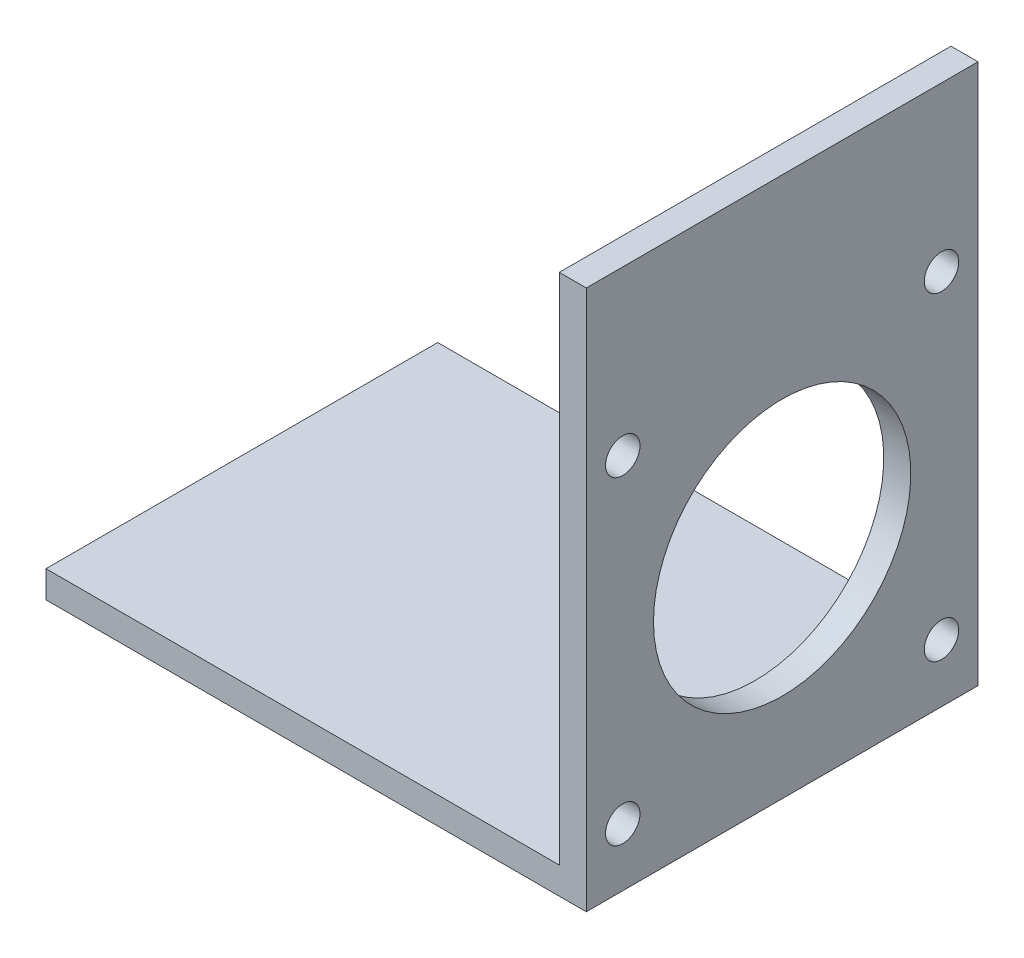
ISO-10303-21;
HEADER;
FILE_DESCRIPTION(('STEP AP214'),'2;1');
FILE_NAME('part.step','',(''),(''),'','','');
FILE_SCHEMA(('AUTOMOTIVE_DESIGN { 1 0 10303 214 1 1 1 1 }'));
ENDSEC;
DATA;
#1=APPLICATION_CONTEXT('core data for automotive mechanical design processes');
#2=APPLICATION_PROTOCOL_DEFINITION('international standard','automotive_design',2000,#1);
#3=PRODUCT_CONTEXT('',#1,'mechanical');
#4=PRODUCT('Part','Part','',(#3));
#5=PRODUCT_RELATED_PRODUCT_CATEGORY('part','',(#4));
#6=PRODUCT_DEFINITION_FORMATION('','',#4);
#7=PRODUCT_DEFINITION_CONTEXT('part definition',#1,'design');
#8=PRODUCT_DEFINITION('design','',#6,#7);
#9=PRODUCT_DEFINITION_SHAPE('','',#8);
#10=(LENGTH_UNIT() NAMED_UNIT(*) SI_UNIT(.MILLI.,.METRE.));
#11=(NAMED_UNIT(*) PLANE_ANGLE_UNIT() SI_UNIT($,.RADIAN.));
#12=(NAMED_UNIT(*) SI_UNIT($,.STERADIAN.) SOLID_ANGLE_UNIT());
#13=UNCERTAINTY_MEASURE_WITH_UNIT(LENGTH_MEASURE(1.E-05),#10,'distance_accuracy_value','');
#14=(GEOMETRIC_REPRESENTATION_CONTEXT(3) GLOBAL_UNCERTAINTY_ASSIGNED_CONTEXT((#13)) GLOBAL_UNIT_ASSIGNED_CONTEXT((#10,
#11,#12)) REPRESENTATION_CONTEXT('',''));
#15=CARTESIAN_POINT('',(0.,0.,0.));
#16=DIRECTION('',(0.,0.,1.));
#17=DIRECTION('',(1.,0.,0.));
#18=AXIS2_PLACEMENT_3D('',#15,#16,#17);
#19=CARTESIAN_POINT('',(80.,4.,0.));
#20=DIRECTION('',(-1.,0.,0.));
#21=DIRECTION('',(0.,0.,1.));
#22=AXIS2_PLACEMENT_3D('',#19,#20,#21);
#23=PLANE('',#22);
#24=CARTESIAN_POINT('',(80.,8.59999999999998,-5.39999999999999));
#25=DIRECTION('',(-1.,0.,0.));
#26=DIRECTION('',(0.,0.,1.));
#27=AXIS2_PLACEMENT_3D('',#24,#25,#26);
#28=CIRCLE('',#27,2.55);
#29=CARTESIAN_POINT('',(80.,8.59999999999998,-2.85));
#30=VERTEX_POINT('',#29);
#31=EDGE_CURVE('E154',#30,#30,#28,.T.);
#32=ORIENTED_EDGE('',*,*,#31,.T.);
#33=EDGE_LOOP('',(#32));
#34=FACE_BOUND('',#33,.T.);
#35=CARTESIAN_POINT('',(80.,55.8,-52.6));
#36=DIRECTION('',(-1.,0.,0.));
#37=DIRECTION('',(0.,0.,1.));
#38=AXIS2_PLACEMENT_3D('',#35,#36,#37);
#39=CIRCLE('',#38,2.55);
#40=CARTESIAN_POINT('',(80.,55.8,-50.05));
#41=VERTEX_POINT('',#40);
#42=EDGE_CURVE('E162',#41,#41,#39,.T.);
#43=ORIENTED_EDGE('',*,*,#42,.T.);
#44=EDGE_LOOP('',(#43));
#45=FACE_BOUND('',#44,.T.);
#46=CARTESIAN_POINT('',(80.,32.2,-29.));
#47=DIRECTION('',(-1.,0.,0.));
#48=DIRECTION('',(0.,0.,1.));
#49=AXIS2_PLACEMENT_3D('',#46,#47,#48);
#50=CIRCLE('',#49,19.05);
#51=CARTESIAN_POINT('',(80.,32.2,-9.95));
#52=VERTEX_POINT('',#51);
#53=EDGE_CURVE('E170',#52,#52,#50,.T.);
#54=ORIENTED_EDGE('',*,*,#53,.T.);
#55=EDGE_LOOP('',(#54));
#56=FACE_BOUND('',#55,.T.);
#57=DIRECTION('',(0.,0.,-1.));
#58=VECTOR('',#57,1.);
#59=CARTESIAN_POINT('',(80.,0.,0.));
#60=LINE('',#59,#58);
#61=CARTESIAN_POINT('',(80.,0.,0.));
#62=VERTEX_POINT('',#61);
#63=CARTESIAN_POINT('',(80.,0.,-58.));
#64=VERTEX_POINT('',#63);
#65=EDGE_CURVE('E86',#62,#64,#60,.T.);
#66=ORIENTED_EDGE('',*,*,#65,.T.);
#67=DIRECTION('',(0.,-1.,0.));
#68=VECTOR('',#67,1.);
#69=CARTESIAN_POINT('',(80.,4.,-58.));
#70=LINE('',#69,#68);
#71=CARTESIAN_POINT('',(80.,80.,-58.));
#72=VERTEX_POINT('',#71);
#73=EDGE_CURVE('E94',#72,#64,#70,.T.);
#74=ORIENTED_EDGE('',*,*,#73,.F.);
#75=DIRECTION('',(0.,0.,-1.));
#76=VECTOR('',#75,1.);
#77=CARTESIAN_POINT('',(80.,80.,0.));
#78=LINE('',#77,#76);
#79=CARTESIAN_POINT('',(80.,80.,0.));
#80=VERTEX_POINT('',#79);
#81=EDGE_CURVE('E147',#80,#72,#78,.T.);
#82=ORIENTED_EDGE('',*,*,#81,.F.);
#83=DIRECTION('',(0.,-1.,0.));
#84=VECTOR('',#83,1.);
#85=CARTESIAN_POINT('',(80.,4.,0.));
#86=LINE('',#85,#84);
#87=EDGE_CURVE('E102',#80,#62,#86,.T.);
#88=ORIENTED_EDGE('',*,*,#87,.T.);
#89=EDGE_LOOP('',(#66,#74,#82,#88));
#90=FACE_BOUND('',#89,.T.);
#91=CARTESIAN_POINT('',(80.,55.8,-5.4));
#92=DIRECTION('',(-1.,0.,0.));
#93=DIRECTION('',(0.,0.,1.));
#94=AXIS2_PLACEMENT_3D('',#91,#92,#93);
#95=CIRCLE('',#94,2.55);
#96=CARTESIAN_POINT('',(80.,55.8,-2.85));
#97=VERTEX_POINT('',#96);
#98=EDGE_CURVE('E166',#97,#97,#95,.F.);
#99=ORIENTED_EDGE('',*,*,#98,.F.);
#100=EDGE_LOOP('',(#99));
#101=FACE_BOUND('',#100,.T.);
#102=CARTESIAN_POINT('',(80.,8.59999999999998,-52.6));
#103=DIRECTION('',(-1.,0.,0.));
#104=DIRECTION('',(0.,0.,1.));
#105=AXIS2_PLACEMENT_3D('',#102,#103,#104);
#106=CIRCLE('',#105,2.55);
#107=CARTESIAN_POINT('',(80.,8.59999999999998,-50.05));
#108=VERTEX_POINT('',#107);
#109=EDGE_CURVE('E158',#108,#108,#106,.F.);
#110=ORIENTED_EDGE('',*,*,#109,.F.);
#111=EDGE_LOOP('',(#110));
#112=FACE_BOUND('',#111,.T.);
#113=ADVANCED_FACE('F38',(#34,#45,#56,#90,#101,#112),#23,.F.);
#114=CARTESIAN_POINT('',(76.,80.,0.));
#115=DIRECTION('',(1.,0.,0.));
#116=DIRECTION('',(0.,0.,-1.));
#117=AXIS2_PLACEMENT_3D('',#114,#115,#116);
#118=PLANE('',#117);
#119=CARTESIAN_POINT('',(76.,8.59999999999998,-5.39999999999999));
#120=DIRECTION('',(-1.,0.,0.));
#121=DIRECTION('',(0.,0.,1.));
#122=AXIS2_PLACEMENT_3D('',#119,#120,#121);
#123=CIRCLE('',#122,2.55);
#124=CARTESIAN_POINT('',(76.,8.59999999999998,-2.85));
#125=VERTEX_POINT('',#124);
#126=EDGE_CURVE('E179',#125,#125,#123,.T.);
#127=ORIENTED_EDGE('',*,*,#126,.F.);
#128=EDGE_LOOP('',(#127));
#129=FACE_BOUND('',#128,.T.);
#130=CARTESIAN_POINT('',(76.,55.8,-52.6));
#131=DIRECTION('',(-1.,0.,0.));
#132=DIRECTION('',(0.,0.,1.));
#133=AXIS2_PLACEMENT_3D('',#130,#131,#132);
#134=CIRCLE('',#133,2.55);
#135=CARTESIAN_POINT('',(76.,55.8,-50.05));
#136=VERTEX_POINT('',#135);
#137=EDGE_CURVE('E187',#136,#136,#134,.T.);
#138=ORIENTED_EDGE('',*,*,#137,.F.);
#139=EDGE_LOOP('',(#138));
#140=FACE_BOUND('',#139,.T.);
#141=CARTESIAN_POINT('',(76.,32.2,-29.));
#142=DIRECTION('',(-1.,0.,0.));
#143=DIRECTION('',(0.,0.,1.));
#144=AXIS2_PLACEMENT_3D('',#141,#142,#143);
#145=CIRCLE('',#144,19.05);
#146=CARTESIAN_POINT('',(76.,32.2,-9.94999999999999));
#147=VERTEX_POINT('',#146);
#148=EDGE_CURVE('E174',#147,#147,#145,.T.);
#149=ORIENTED_EDGE('',*,*,#148,.F.);
#150=EDGE_LOOP('',(#149));
#151=FACE_BOUND('',#150,.T.);
#152=DIRECTION('',(0.,0.,-1.));
#153=VECTOR('',#152,1.);
#154=CARTESIAN_POINT('',(76.,4.,0.));
#155=LINE('',#154,#153);
#156=CARTESIAN_POINT('',(76.,4.,0.));
#157=VERTEX_POINT('',#156);
#158=CARTESIAN_POINT('',(76.,4.,-58.));
#159=VERTEX_POINT('',#158);
#160=EDGE_CURVE('E90',#157,#159,#155,.T.);
#161=ORIENTED_EDGE('',*,*,#160,.F.);
#162=DIRECTION('',(0.,-1.,0.));
#163=VECTOR('',#162,1.);
#164=CARTESIAN_POINT('',(76.,80.,0.));
#165=LINE('',#164,#163);
#166=CARTESIAN_POINT('',(76.,80.,0.));
#167=VERTEX_POINT('',#166);
#168=EDGE_CURVE('E138',#167,#157,#165,.T.);
#169=ORIENTED_EDGE('',*,*,#168,.F.);
#170=DIRECTION('',(0.,0.,1.));
#171=VECTOR('',#170,1.);
#172=CARTESIAN_POINT('',(76.,80.,0.));
#173=LINE('',#172,#171);
#174=CARTESIAN_POINT('',(76.,80.,-58.));
#175=VERTEX_POINT('',#174);
#176=EDGE_CURVE('E141',#175,#167,#173,.T.);
#177=ORIENTED_EDGE('',*,*,#176,.F.);
#178=DIRECTION('',(0.,-1.,0.));
#179=VECTOR('',#178,1.);
#180=CARTESIAN_POINT('',(76.,80.,-58.));
#181=LINE('',#180,#179);
#182=EDGE_CURVE('E54',#175,#159,#181,.T.);
#183=ORIENTED_EDGE('',*,*,#182,.T.);
#184=EDGE_LOOP('',(#161,#169,#177,#183));
#185=FACE_BOUND('',#184,.T.);
#186=CARTESIAN_POINT('',(76.,55.8,-5.4));
#187=DIRECTION('',(-1.,0.,0.));
#188=DIRECTION('',(0.,0.,1.));
#189=AXIS2_PLACEMENT_3D('',#186,#187,#188);
#190=CIRCLE('',#189,2.55);
#191=CARTESIAN_POINT('',(76.,55.8,-2.85));
#192=VERTEX_POINT('',#191);
#193=EDGE_CURVE('E178',#192,#192,#190,.F.);
#194=ORIENTED_EDGE('',*,*,#193,.T.);
#195=EDGE_LOOP('',(#194));
#196=FACE_BOUND('',#195,.T.);
#197=CARTESIAN_POINT('',(76.,8.59999999999998,-52.6));
#198=DIRECTION('',(-1.,0.,0.));
#199=DIRECTION('',(0.,0.,1.));
#200=AXIS2_PLACEMENT_3D('',#197,#198,#199);
#201=CIRCLE('',#200,2.55);
#202=CARTESIAN_POINT('',(76.,8.59999999999998,-50.05));
#203=VERTEX_POINT('',#202);
#204=EDGE_CURVE('E183',#203,#203,#201,.F.);
#205=ORIENTED_EDGE('',*,*,#204,.T.);
#206=EDGE_LOOP('',(#205));
#207=FACE_BOUND('',#206,.T.);
#208=ADVANCED_FACE('F195',(#129,#140,#151,#185,#196,#207),#118,.F.);
#209=CARTESIAN_POINT('',(0.,4.,0.));
#210=DIRECTION('',(0.,1.,0.));
#211=DIRECTION('',(0.,0.,1.));
#212=AXIS2_PLACEMENT_3D('',#209,#210,#211);
#213=PLANE('',#212);
#214=DIRECTION('',(1.,0.,0.));
#215=VECTOR('',#214,1.);
#216=CARTESIAN_POINT('',(0.,4.,0.));
#217=LINE('',#216,#215);
#218=CARTESIAN_POINT('',(0.,4.,0.));
#219=VERTEX_POINT('',#218);
#220=EDGE_CURVE('E103',#219,#157,#217,.T.);
#221=ORIENTED_EDGE('',*,*,#220,.T.);
#222=ORIENTED_EDGE('',*,*,#160,.T.);
#223=DIRECTION('',(1.,0.,0.));
#224=VECTOR('',#223,1.);
#225=CARTESIAN_POINT('',(0.,4.,-58.));
#226=LINE('',#225,#224);
#227=CARTESIAN_POINT('',(0.,4.,-58.));
#228=VERTEX_POINT('',#227);
#229=EDGE_CURVE('E109',#228,#159,#226,.T.);
#230=ORIENTED_EDGE('',*,*,#229,.F.);
#231=DIRECTION('',(0.,0.,-1.));
#232=VECTOR('',#231,1.);
#233=CARTESIAN_POINT('',(0.,4.,0.));
#234=LINE('',#233,#232);
#235=EDGE_CURVE('E115',#219,#228,#234,.T.);
#236=ORIENTED_EDGE('',*,*,#235,.F.);
#237=EDGE_LOOP('',(#221,#222,#230,#236));
#238=FACE_BOUND('',#237,.T.);
#239=ADVANCED_FACE('F235',(#238),#213,.T.);
#240=CARTESIAN_POINT('',(0.,4.,-58.));
#241=DIRECTION('',(0.,0.,-1.));
#242=DIRECTION('',(-1.,0.,0.));
#243=AXIS2_PLACEMENT_3D('',#240,#241,#242);
#244=PLANE('',#243);
#245=ORIENTED_EDGE('',*,*,#73,.T.);
#246=DIRECTION('',(1.,0.,0.));
#247=VECTOR('',#246,1.);
#248=CARTESIAN_POINT('',(0.,0.,-58.));
#249=LINE('',#248,#247);
#250=CARTESIAN_POINT('',(0.,0.,-58.));
#251=VERTEX_POINT('',#250);
#252=EDGE_CURVE('E81',#251,#64,#249,.T.);
#253=ORIENTED_EDGE('',*,*,#252,.F.);
#254=DIRECTION('',(0.,-1.,0.));
#255=VECTOR('',#254,1.);
#256=CARTESIAN_POINT('',(0.,4.,-58.));
#257=LINE('',#256,#255);
#258=EDGE_CURVE('E11',#228,#251,#257,.T.);
#259=ORIENTED_EDGE('',*,*,#258,.F.);
#260=ORIENTED_EDGE('',*,*,#229,.T.);
#261=ORIENTED_EDGE('',*,*,#182,.F.);
#262=DIRECTION('',(1.,0.,0.));
#263=VECTOR('',#262,1.);
#264=CARTESIAN_POINT('',(0.,80.,-58.));
#265=LINE('',#264,#263);
#266=EDGE_CURVE('E97',#175,#72,#265,.T.);
#267=ORIENTED_EDGE('',*,*,#266,.T.);
#268=EDGE_LOOP('',(#245,#253,#259,#260,#261,#267));
#269=FACE_BOUND('',#268,.T.);
#270=ADVANCED_FACE('F40',(#269),#244,.T.);
#271=CARTESIAN_POINT('',(0.,4.,0.));
#272=DIRECTION('',(-1.,0.,0.));
#273=DIRECTION('',(0.,0.,1.));
#274=AXIS2_PLACEMENT_3D('',#271,#272,#273);
#275=PLANE('',#274);
#276=DIRECTION('',(0.,0.,-1.));
#277=VECTOR('',#276,1.);
#278=CARTESIAN_POINT('',(0.,0.,0.));
#279=LINE('',#278,#277);
#280=CARTESIAN_POINT('',(0.,0.,0.));
#281=VERTEX_POINT('',#280);
#282=EDGE_CURVE('E87',#281,#251,#279,.T.);
#283=ORIENTED_EDGE('',*,*,#282,.F.);
#284=DIRECTION('',(0.,-1.,0.));
#285=VECTOR('',#284,1.);
#286=CARTESIAN_POINT('',(0.,4.,0.));
#287=LINE('',#286,#285);
#288=EDGE_CURVE('E47',#219,#281,#287,.T.);
#289=ORIENTED_EDGE('',*,*,#288,.F.);
#290=ORIENTED_EDGE('',*,*,#235,.T.);
#291=ORIENTED_EDGE('',*,*,#258,.T.);
#292=EDGE_LOOP('',(#283,#289,#290,#291));
#293=FACE_BOUND('',#292,.T.);
#294=ADVANCED_FACE('F127',(#293),#275,.T.);
#295=CARTESIAN_POINT('',(0.,4.,0.));
#296=DIRECTION('',(0.,0.,-1.));
#297=DIRECTION('',(-1.,0.,0.));
#298=AXIS2_PLACEMENT_3D('',#295,#296,#297);
#299=PLANE('',#298);
#300=ORIENTED_EDGE('',*,*,#87,.F.);
#301=DIRECTION('',(1.,0.,0.));
#302=VECTOR('',#301,1.);
#303=CARTESIAN_POINT('',(0.,80.,0.));
#304=LINE('',#303,#302);
#305=EDGE_CURVE('E150',#167,#80,#304,.T.);
#306=ORIENTED_EDGE('',*,*,#305,.F.);
#307=ORIENTED_EDGE('',*,*,#168,.T.);
#308=ORIENTED_EDGE('',*,*,#220,.F.);
#309=ORIENTED_EDGE('',*,*,#288,.T.);
#310=DIRECTION('',(1.,0.,0.));
#311=VECTOR('',#310,1.);
#312=CARTESIAN_POINT('',(0.,0.,0.));
#313=LINE('',#312,#311);
#314=EDGE_CURVE('E110',#281,#62,#313,.T.);
#315=ORIENTED_EDGE('',*,*,#314,.T.);
#316=EDGE_LOOP('',(#300,#306,#307,#308,#309,#315));
#317=FACE_BOUND('',#316,.T.);
#318=ADVANCED_FACE('F123',(#317),#299,.F.);
#319=CARTESIAN_POINT('',(0.,0.,0.));
#320=DIRECTION('',(0.,1.,0.));
#321=DIRECTION('',(0.,0.,1.));
#322=AXIS2_PLACEMENT_3D('',#319,#320,#321);
#323=PLANE('',#322);
#324=ORIENTED_EDGE('',*,*,#65,.F.);
#325=ORIENTED_EDGE('',*,*,#314,.F.);
#326=ORIENTED_EDGE('',*,*,#282,.T.);
#327=ORIENTED_EDGE('',*,*,#252,.T.);
#328=EDGE_LOOP('',(#324,#325,#326,#327));
#329=FACE_BOUND('',#328,.T.);
#330=ADVANCED_FACE('F83',(#329),#323,.F.);
#331=CARTESIAN_POINT('',(0.,80.,0.));
#332=DIRECTION('',(0.,1.,0.));
#333=DIRECTION('',(0.,0.,1.));
#334=AXIS2_PLACEMENT_3D('',#331,#332,#333);
#335=PLANE('',#334);
#336=ORIENTED_EDGE('',*,*,#305,.T.);
#337=ORIENTED_EDGE('',*,*,#81,.T.);
#338=ORIENTED_EDGE('',*,*,#266,.F.);
#339=ORIENTED_EDGE('',*,*,#176,.T.);
#340=EDGE_LOOP('',(#336,#337,#338,#339));
#341=FACE_BOUND('',#340,.T.);
#342=ADVANCED_FACE('F228',(#341),#335,.T.);
#343=CARTESIAN_POINT('',(156.,32.2,-29.));
#344=DIRECTION('',(-1.,0.,0.));
#345=DIRECTION('',(0.,0.,1.));
#346=AXIS2_PLACEMENT_3D('',#343,#344,#345);
#347=CYLINDRICAL_SURFACE('',#346,19.05);
#348=ORIENTED_EDGE('',*,*,#148,.T.);
#349=EDGE_LOOP('',(#348));
#350=FACE_BOUND('',#349,.T.);
#351=ORIENTED_EDGE('',*,*,#53,.F.);
#352=EDGE_LOOP('',(#351));
#353=FACE_BOUND('',#352,.T.);
#354=ADVANCED_FACE('F202',(#350,#353),#347,.F.);
#355=CARTESIAN_POINT('',(156.,55.8,-5.40000000000002));
#356=DIRECTION('',(-1.,0.,0.));
#357=DIRECTION('',(0.,0.,1.));
#358=AXIS2_PLACEMENT_3D('',#355,#356,#357);
#359=CYLINDRICAL_SURFACE('',#358,2.55);
#360=ORIENTED_EDGE('',*,*,#193,.F.);
#361=EDGE_LOOP('',(#360));
#362=FACE_BOUND('',#361,.T.);
#363=ORIENTED_EDGE('',*,*,#98,.T.);
#364=EDGE_LOOP('',(#363));
#365=FACE_BOUND('',#364,.T.);
#366=ADVANCED_FACE('F198',(#362,#365),#359,.F.);
#367=CARTESIAN_POINT('',(156.,55.8,-52.6));
#368=DIRECTION('',(-1.,0.,0.));
#369=DIRECTION('',(0.,0.,1.));
#370=AXIS2_PLACEMENT_3D('',#367,#368,#369);
#371=CYLINDRICAL_SURFACE('',#370,2.55);
#372=ORIENTED_EDGE('',*,*,#137,.T.);
#373=EDGE_LOOP('',(#372));
#374=FACE_BOUND('',#373,.T.);
#375=ORIENTED_EDGE('',*,*,#42,.F.);
#376=EDGE_LOOP('',(#375));
#377=FACE_BOUND('',#376,.T.);
#378=ADVANCED_FACE('F201',(#374,#377),#371,.F.);
#379=CARTESIAN_POINT('',(156.,8.59999999999998,-52.6));
#380=DIRECTION('',(-1.,0.,0.));
#381=DIRECTION('',(0.,0.,1.));
#382=AXIS2_PLACEMENT_3D('',#379,#380,#381);
#383=CYLINDRICAL_SURFACE('',#382,2.55);
#384=ORIENTED_EDGE('',*,*,#204,.F.);
#385=EDGE_LOOP('',(#384));
#386=FACE_BOUND('',#385,.T.);
#387=ORIENTED_EDGE('',*,*,#109,.T.);
#388=EDGE_LOOP('',(#387));
#389=FACE_BOUND('',#388,.T.);
#390=ADVANCED_FACE('F211',(#386,#389),#383,.F.);
#391=CARTESIAN_POINT('',(156.,8.59999999999998,-5.40000000000001));
#392=DIRECTION('',(-1.,0.,0.));
#393=DIRECTION('',(0.,0.,1.));
#394=AXIS2_PLACEMENT_3D('',#391,#392,#393);
#395=CYLINDRICAL_SURFACE('',#394,2.55);
#396=ORIENTED_EDGE('',*,*,#126,.T.);
#397=EDGE_LOOP('',(#396));
#398=FACE_BOUND('',#397,.T.);
#399=ORIENTED_EDGE('',*,*,#31,.F.);
#400=EDGE_LOOP('',(#399));
#401=FACE_BOUND('',#400,.T.);
#402=ADVANCED_FACE('F213',(#398,#401),#395,.F.);
#403=CLOSED_SHELL('',(#113,#208,#239,#270,#294,#318,#330,#342,#354,#366,#378,#390,#402));
#404=MANIFOLD_SOLID_BREP('B2',#403);
#405=ADVANCED_BREP_SHAPE_REPRESENTATION('',(#18,#404),#14);
#406=SHAPE_DEFINITION_REPRESENTATION(#9,#405);
ENDSEC;
END-ISO-10303-21;
